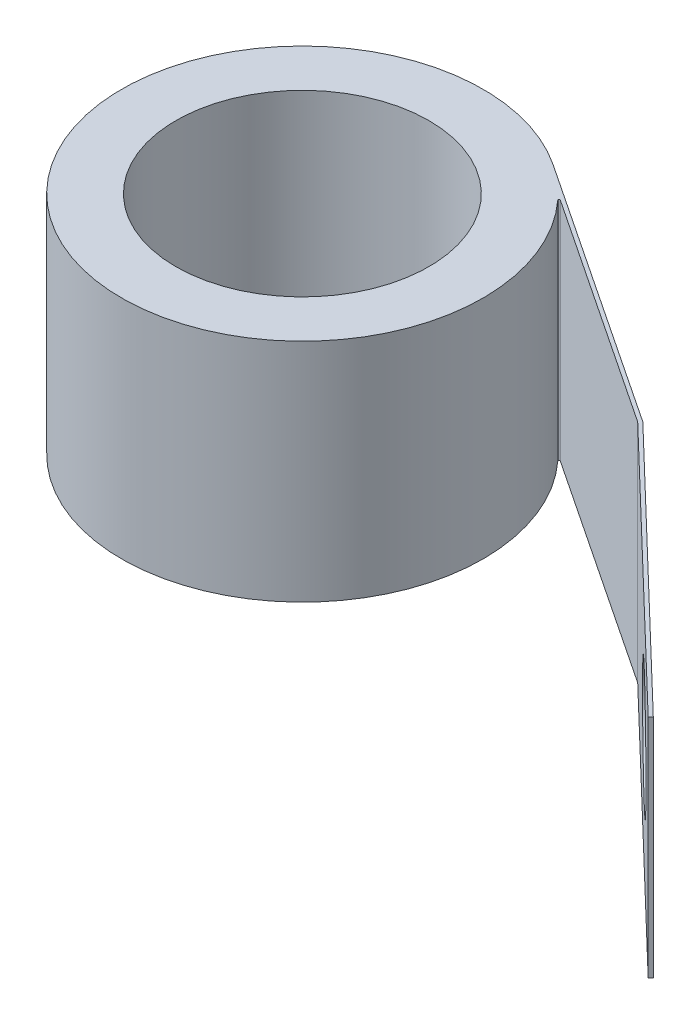
ISO-10303-21;
HEADER;
FILE_DESCRIPTION(('STEP AP214'),'2;1');
FILE_NAME('part.step','',(''),(''),'','','');
FILE_SCHEMA(('AUTOMOTIVE_DESIGN { 1 0 10303 214 1 1 1 1 }'));
ENDSEC;
DATA;
#1=APPLICATION_CONTEXT('core data for automotive mechanical design processes');
#2=APPLICATION_PROTOCOL_DEFINITION('international standard','automotive_design',2000,#1);
#3=PRODUCT_CONTEXT('',#1,'mechanical');
#4=PRODUCT('Part','Part','',(#3));
#5=PRODUCT_RELATED_PRODUCT_CATEGORY('part','',(#4));
#6=PRODUCT_DEFINITION_FORMATION('','',#4);
#7=PRODUCT_DEFINITION_CONTEXT('part definition',#1,'design');
#8=PRODUCT_DEFINITION('design','',#6,#7);
#9=PRODUCT_DEFINITION_SHAPE('','',#8);
#10=(LENGTH_UNIT() NAMED_UNIT(*) SI_UNIT(.MILLI.,.METRE.));
#11=(NAMED_UNIT(*) PLANE_ANGLE_UNIT() SI_UNIT($,.RADIAN.));
#12=(NAMED_UNIT(*) SI_UNIT($,.STERADIAN.) SOLID_ANGLE_UNIT());
#13=UNCERTAINTY_MEASURE_WITH_UNIT(LENGTH_MEASURE(1.E-05),#10,'distance_accuracy_value','');
#14=(GEOMETRIC_REPRESENTATION_CONTEXT(3) GLOBAL_UNCERTAINTY_ASSIGNED_CONTEXT((#13)) GLOBAL_UNIT_ASSIGNED_CONTEXT((#10,
#11,#12)) REPRESENTATION_CONTEXT('',''));
#15=CARTESIAN_POINT('',(0.,0.,0.));
#16=DIRECTION('',(0.,0.,1.));
#17=DIRECTION('',(1.,0.,0.));
#18=AXIS2_PLACEMENT_3D('',#15,#16,#17);
#19=CARTESIAN_POINT('',(0.,6.35,0.));
#20=DIRECTION('',(0.,-1.,0.));
#21=DIRECTION('',(0.,0.,-1.));
#22=AXIS2_PLACEMENT_3D('',#19,#20,#21);
#23=CYLINDRICAL_SURFACE('',#22,5.08);
#24=CARTESIAN_POINT('',(0.,0.,0.));
#25=DIRECTION('',(0.,1.,0.));
#26=DIRECTION('',(0.,0.,1.));
#27=AXIS2_PLACEMENT_3D('',#24,#25,#26);
#28=CIRCLE('',#27,5.08);
#29=CARTESIAN_POINT('',(2.81193797442188,0.,-4.23076882233055));
#30=VERTEX_POINT('',#29);
#31=CARTESIAN_POINT('',(3.74952969267497,0.,-3.42745198124624));
#32=VERTEX_POINT('',#31);
#33=EDGE_CURVE('E131',#30,#32,#28,.T.);
#34=ORIENTED_EDGE('',*,*,#33,.T.);
#35=DIRECTION('',(0.,-1.,0.));
#36=VECTOR('',#35,1.);
#37=CARTESIAN_POINT('',(3.74952969267497,6.35,-3.42745198124624));
#38=LINE('',#37,#36);
#39=CARTESIAN_POINT('',(3.74952969267497,6.35,-3.42745198124624));
#40=VERTEX_POINT('',#39);
#41=EDGE_CURVE('E50',#32,#40,#38,.F.);
#42=ORIENTED_EDGE('',*,*,#41,.T.);
#43=CARTESIAN_POINT('',(0.,6.35,0.));
#44=DIRECTION('',(0.,1.,0.));
#45=DIRECTION('',(0.,0.,1.));
#46=AXIS2_PLACEMENT_3D('',#43,#44,#45);
#47=CIRCLE('',#46,5.08);
#48=CARTESIAN_POINT('',(2.81193797442188,6.35,-4.23076882233055));
#49=VERTEX_POINT('',#48);
#50=EDGE_CURVE('E115',#49,#40,#47,.T.);
#51=ORIENTED_EDGE('',*,*,#50,.F.);
#52=DIRECTION('',(0.,-1.,0.));
#53=VECTOR('',#52,1.);
#54=CARTESIAN_POINT('',(2.81193797442188,6.35,-4.23076882233055));
#55=LINE('',#54,#53);
#56=EDGE_CURVE('E127',#49,#30,#55,.T.);
#57=ORIENTED_EDGE('',*,*,#56,.T.);
#58=EDGE_LOOP('',(#34,#42,#51,#57));
#59=FACE_BOUND('',#58,.T.);
#60=ADVANCED_FACE('F35',(#59),#23,.T.);
#61=CARTESIAN_POINT('',(2.75659084902538,6.35,-4.14749497537407));
#62=DIRECTION('',(-0.553531097327141,0.,0.832828508332784));
#63=DIRECTION('',(0.832828508332784,0.,0.553531097327141));
#64=AXIS2_PLACEMENT_3D('',#61,#62,#63);
#65=PLANE('',#64);
#66=DIRECTION('',(-0.832828508332784,0.,-0.553531097327141));
#67=VECTOR('',#66,1.);
#68=CARTESIAN_POINT('',(2.75659084902538,6.35,-4.14749497537407));
#69=LINE('',#68,#67);
#70=CARTESIAN_POINT('',(10.2646335648522,6.35,0.842650152571072));
#71=VERTEX_POINT('',#70);
#72=CARTESIAN_POINT('',(3.78233703101045,6.35,-3.46574308526412));
#73=VERTEX_POINT('',#72);
#74=EDGE_CURVE('E98',#71,#73,#69,.T.);
#75=ORIENTED_EDGE('',*,*,#74,.T.);
#76=DIRECTION('',(0.,-1.,0.));
#77=VECTOR('',#76,1.);
#78=CARTESIAN_POINT('',(3.78233703101045,6.35,-3.46574308526412));
#79=LINE('',#78,#77);
#80=CARTESIAN_POINT('',(3.78233703101045,0.,-3.46574308526412));
#81=VERTEX_POINT('',#80);
#82=EDGE_CURVE('E105',#73,#81,#79,.T.);
#83=ORIENTED_EDGE('',*,*,#82,.T.);
#84=DIRECTION('',(-0.832828508332784,0.,-0.553531097327141));
#85=VECTOR('',#84,1.);
#86=CARTESIAN_POINT('',(2.75659084902538,0.,-4.14749497537407));
#87=LINE('',#86,#85);
#88=CARTESIAN_POINT('',(10.2646335648522,0.,0.842650152571072));
#89=VERTEX_POINT('',#88);
#90=EDGE_CURVE('E100',#89,#81,#87,.T.);
#91=ORIENTED_EDGE('',*,*,#90,.F.);
#92=DIRECTION('',(0.,-1.,0.));
#93=VECTOR('',#92,1.);
#94=CARTESIAN_POINT('',(10.2646335648522,6.35,0.842650152571072));
#95=LINE('',#94,#93);
#96=EDGE_CURVE('E94',#71,#89,#95,.T.);
#97=ORIENTED_EDGE('',*,*,#96,.F.);
#98=EDGE_LOOP('',(#75,#83,#91,#97));
#99=FACE_BOUND('',#98,.T.);
#100=ADVANCED_FACE('F96',(#99),#65,.T.);
#101=CARTESIAN_POINT('',(4.5010411134167,6.35,-4.68941669030728));
#102=DIRECTION('',(-0.69246786360257,0.,0.721448721585736));
#103=DIRECTION('',(0.721448721585736,0.,0.69246786360257));
#104=AXIS2_PLACEMENT_3D('',#101,#102,#103);
#105=PLANE('',#104);
#106=CARTESIAN_POINT('',(14.8458329469216,3.175,5.2398210864474));
#107=DIRECTION('',(-0.69246786360257,0.,0.721448721585736));
#108=DIRECTION('',(0.721448721585736,0.,0.69246786360257));
#109=AXIS2_PLACEMENT_3D('',#106,#107,#108);
#110=CIRCLE('',#109,1.651);
#111=CARTESIAN_POINT('',(13.6547211075836,3.175,4.09655664363956));
#112=VERTEX_POINT('',#111);
#113=EDGE_CURVE('E132',#112,#112,#110,.T.);
#114=ORIENTED_EDGE('',*,*,#113,.F.);
#115=EDGE_LOOP('',(#114));
#116=FACE_BOUND('',#115,.T.);
#117=DIRECTION('',(-0.721448721585736,0.,-0.69246786360257));
#118=VECTOR('',#117,1.);
#119=CARTESIAN_POINT('',(4.5010411134167,0.,-4.68941669030728));
#120=LINE('',#119,#118);
#121=CARTESIAN_POINT('',(17.5945525761633,0.,7.87812364677318));
#122=VERTEX_POINT('',#121);
#123=EDGE_CURVE('E135',#122,#89,#120,.T.);
#124=ORIENTED_EDGE('',*,*,#123,.F.);
#125=DIRECTION('',(0.,-1.,0.));
#126=VECTOR('',#125,1.);
#127=CARTESIAN_POINT('',(17.5945525761633,6.35,7.87812364677318));
#128=LINE('',#127,#126);
#129=CARTESIAN_POINT('',(17.5945525761633,6.35,7.87812364677318));
#130=VERTEX_POINT('',#129);
#131=EDGE_CURVE('E106',#130,#122,#128,.T.);
#132=ORIENTED_EDGE('',*,*,#131,.F.);
#133=DIRECTION('',(-0.721448721585736,0.,-0.69246786360257));
#134=VECTOR('',#133,1.);
#135=CARTESIAN_POINT('',(4.5010411134167,6.35,-4.68941669030728));
#136=LINE('',#135,#134);
#137=EDGE_CURVE('E112',#130,#71,#136,.T.);
#138=ORIENTED_EDGE('',*,*,#137,.T.);
#139=ORIENTED_EDGE('',*,*,#96,.T.);
#140=EDGE_LOOP('',(#124,#132,#138,#139));
#141=FACE_BOUND('',#140,.T.);
#142=ADVANCED_FACE('F117',(#116,#141),#105,.T.);
#143=CARTESIAN_POINT('',(13.0935114627457,6.35,12.5675403370809));
#144=DIRECTION('',(0.721448721585702,0.,0.692467863602605));
#145=DIRECTION('',(0.692467863602605,0.,-0.721448721585702));
#146=AXIS2_PLACEMENT_3D('',#143,#144,#145);
#147=PLANE('',#146);
#148=DIRECTION('',(-0.692467863602605,0.,0.721448721585702));
#149=VECTOR('',#148,1.);
#150=CARTESIAN_POINT('',(13.0935114627457,0.,12.5675403370809));
#151=LINE('',#150,#149);
#152=CARTESIAN_POINT('',(17.6649073111053,0.,7.80482445666008));
#153=VERTEX_POINT('',#152);
#154=EDGE_CURVE('E137',#153,#122,#151,.T.);
#155=ORIENTED_EDGE('',*,*,#154,.F.);
#156=DIRECTION('',(0.,-1.,0.));
#157=VECTOR('',#156,1.);
#158=CARTESIAN_POINT('',(17.6649073111053,6.35,7.80482445666008));
#159=LINE('',#158,#157);
#160=CARTESIAN_POINT('',(17.6649073111053,6.35,7.80482445666008));
#161=VERTEX_POINT('',#160);
#162=EDGE_CURVE('E150',#161,#153,#159,.T.);
#163=ORIENTED_EDGE('',*,*,#162,.F.);
#164=DIRECTION('',(-0.692467863602605,0.,0.721448721585702));
#165=VECTOR('',#164,1.);
#166=CARTESIAN_POINT('',(13.0935114627457,6.35,12.5675403370809));
#167=LINE('',#166,#165);
#168=EDGE_CURVE('E118',#161,#130,#167,.T.);
#169=ORIENTED_EDGE('',*,*,#168,.T.);
#170=ORIENTED_EDGE('',*,*,#131,.T.);
#171=EDGE_LOOP('',(#155,#163,#169,#170));
#172=FACE_BOUND('',#171,.T.);
#173=ADVANCED_FACE('F160',(#172),#147,.T.);
#174=CARTESIAN_POINT('',(4.57139584835872,6.35,-4.76271588042039));
#175=DIRECTION('',(-0.69246786360257,0.,0.721448721585736));
#176=DIRECTION('',(0.721448721585736,0.,0.69246786360257));
#177=AXIS2_PLACEMENT_3D('',#174,#175,#176);
#178=PLANE('',#177);
#179=CARTESIAN_POINT('',(14.9161876818636,3.175,5.16652189633428));
#180=DIRECTION('',(0.69246786360257,0.,-0.721448721585736));
#181=DIRECTION('',(-0.721448721585736,0.,-0.69246786360257));
#182=AXIS2_PLACEMENT_3D('',#179,#180,#181);
#183=CIRCLE('',#182,1.651);
#184=CARTESIAN_POINT('',(13.7250758425256,3.175,4.02325745352644));
#185=VERTEX_POINT('',#184);
#186=EDGE_CURVE('E174',#185,#185,#183,.T.);
#187=ORIENTED_EDGE('',*,*,#186,.F.);
#188=EDGE_LOOP('',(#187));
#189=FACE_BOUND('',#188,.T.);
#190=DIRECTION('',(-0.721448721585736,0.,-0.69246786360257));
#191=VECTOR('',#190,1.);
#192=CARTESIAN_POINT('',(4.57139584835872,0.,-4.76271588042039));
#193=LINE('',#192,#191);
#194=CARTESIAN_POINT('',(10.3349882997942,0.,0.769350962457961));
#195=VERTEX_POINT('',#194);
#196=EDGE_CURVE('E140',#153,#195,#193,.T.);
#197=ORIENTED_EDGE('',*,*,#196,.T.);
#198=DIRECTION('',(0.,-1.,0.));
#199=VECTOR('',#198,1.);
#200=CARTESIAN_POINT('',(10.3349882997942,6.35,0.769350962457961));
#201=LINE('',#200,#199);
#202=CARTESIAN_POINT('',(10.3349882997942,6.35,0.769350962457961));
#203=VERTEX_POINT('',#202);
#204=EDGE_CURVE('E147',#203,#195,#201,.T.);
#205=ORIENTED_EDGE('',*,*,#204,.F.);
#206=DIRECTION('',(-0.721448721585736,0.,-0.69246786360257));
#207=VECTOR('',#206,1.);
#208=CARTESIAN_POINT('',(4.57139584835872,6.35,-4.76271588042039));
#209=LINE('',#208,#207);
#210=EDGE_CURVE('E120',#161,#203,#209,.T.);
#211=ORIENTED_EDGE('',*,*,#210,.F.);
#212=ORIENTED_EDGE('',*,*,#162,.T.);
#213=EDGE_LOOP('',(#197,#205,#211,#212));
#214=FACE_BOUND('',#213,.T.);
#215=ADVANCED_FACE('F166',(#189,#214),#178,.F.);
#216=CARTESIAN_POINT('',(0.,6.35,0.));
#217=DIRECTION('',(0.,-1.,0.));
#218=DIRECTION('',(0.,0.,-1.));
#219=AXIS2_PLACEMENT_3D('',#216,#217,#218);
#220=CYLINDRICAL_SURFACE('',#219,3.556);
#221=CARTESIAN_POINT('',(0.,6.35,0.));
#222=DIRECTION('',(0.,1.,0.));
#223=DIRECTION('',(0.,0.,1.));
#224=AXIS2_PLACEMENT_3D('',#221,#222,#223);
#225=CIRCLE('',#224,3.556);
#226=CARTESIAN_POINT('',(0.,6.35,3.556));
#227=VERTEX_POINT('',#226);
#228=EDGE_CURVE('E144',#227,#227,#225,.T.);
#229=ORIENTED_EDGE('',*,*,#228,.T.);
#230=EDGE_LOOP('',(#229));
#231=FACE_BOUND('',#230,.T.);
#232=CARTESIAN_POINT('',(0.,0.,0.));
#233=DIRECTION('',(0.,1.,0.));
#234=DIRECTION('',(0.,0.,1.));
#235=AXIS2_PLACEMENT_3D('',#232,#233,#234);
#236=CIRCLE('',#235,3.556);
#237=CARTESIAN_POINT('',(0.,0.,3.556));
#238=VERTEX_POINT('',#237);
#239=EDGE_CURVE('E128',#238,#238,#236,.T.);
#240=ORIENTED_EDGE('',*,*,#239,.F.);
#241=EDGE_LOOP('',(#240));
#242=FACE_BOUND('',#241,.T.);
#243=ADVANCED_FACE('F181',(#231,#242),#220,.F.);
#244=CARTESIAN_POINT('',(2.81193797442188,6.35,-4.23076882233055));
#245=DIRECTION('',(-0.553531097327141,0.,0.832828508332784));
#246=DIRECTION('',(0.832828508332784,0.,0.553531097327141));
#247=AXIS2_PLACEMENT_3D('',#244,#245,#246);
#248=PLANE('',#247);
#249=DIRECTION('',(-0.832828508332784,0.,-0.553531097327141));
#250=VECTOR('',#249,1.);
#251=CARTESIAN_POINT('',(2.81193797442188,0.,-4.23076882233055));
#252=LINE('',#251,#250);
#253=EDGE_CURVE('E142',#195,#30,#252,.T.);
#254=ORIENTED_EDGE('',*,*,#253,.T.);
#255=ORIENTED_EDGE('',*,*,#56,.F.);
#256=DIRECTION('',(-0.832828508332784,0.,-0.553531097327141));
#257=VECTOR('',#256,1.);
#258=CARTESIAN_POINT('',(2.81193797442188,6.35,-4.23076882233055));
#259=LINE('',#258,#257);
#260=EDGE_CURVE('E125',#203,#49,#259,.T.);
#261=ORIENTED_EDGE('',*,*,#260,.F.);
#262=ORIENTED_EDGE('',*,*,#204,.T.);
#263=EDGE_LOOP('',(#254,#255,#261,#262));
#264=FACE_BOUND('',#263,.T.);
#265=ADVANCED_FACE('F168',(#264),#248,.F.);
#266=CARTESIAN_POINT('',(0.,6.35,0.));
#267=DIRECTION('',(0.,1.,0.));
#268=DIRECTION('',(0.,0.,1.));
#269=AXIS2_PLACEMENT_3D('',#266,#267,#268);
#270=PLANE('',#269);
#271=ORIENTED_EDGE('',*,*,#228,.F.);
#272=EDGE_LOOP('',(#271));
#273=FACE_BOUND('',#272,.T.);
#274=ORIENTED_EDGE('',*,*,#50,.T.);
#275=CARTESIAN_POINT('',(3.76827734113834,6.35,-3.44458924115247));
#276=DIRECTION('',(0.,1.,0.));
#277=DIRECTION('',(0.,0.,1.));
#278=AXIS2_PLACEMENT_3D('',#275,#276,#277);
#279=CIRCLE('',#278,0.0254);
#280=EDGE_CURVE('E11',#40,#73,#279,.F.);
#281=ORIENTED_EDGE('',*,*,#280,.T.);
#282=ORIENTED_EDGE('',*,*,#74,.F.);
#283=ORIENTED_EDGE('',*,*,#137,.F.);
#284=ORIENTED_EDGE('',*,*,#168,.F.);
#285=ORIENTED_EDGE('',*,*,#210,.T.);
#286=ORIENTED_EDGE('',*,*,#260,.T.);
#287=EDGE_LOOP('',(#274,#281,#282,#283,#284,#285,#286));
#288=FACE_BOUND('',#287,.T.);
#289=ADVANCED_FACE('F110',(#273,#288),#270,.T.);
#290=CARTESIAN_POINT('',(0.,0.,0.));
#291=DIRECTION('',(0.,1.,0.));
#292=DIRECTION('',(0.,0.,1.));
#293=AXIS2_PLACEMENT_3D('',#290,#291,#292);
#294=PLANE('',#293);
#295=ORIENTED_EDGE('',*,*,#239,.T.);
#296=EDGE_LOOP('',(#295));
#297=FACE_BOUND('',#296,.T.);
#298=ORIENTED_EDGE('',*,*,#33,.F.);
#299=ORIENTED_EDGE('',*,*,#253,.F.);
#300=ORIENTED_EDGE('',*,*,#196,.F.);
#301=ORIENTED_EDGE('',*,*,#154,.T.);
#302=ORIENTED_EDGE('',*,*,#123,.T.);
#303=ORIENTED_EDGE('',*,*,#90,.T.);
#304=CARTESIAN_POINT('',(3.76827734113834,0.,-3.44458924115247));
#305=DIRECTION('',(0.,1.,0.));
#306=DIRECTION('',(0.,0.,1.));
#307=AXIS2_PLACEMENT_3D('',#304,#305,#306);
#308=CIRCLE('',#307,0.0254);
#309=EDGE_CURVE('E43',#81,#32,#308,.T.);
#310=ORIENTED_EDGE('',*,*,#309,.T.);
#311=EDGE_LOOP('',(#298,#299,#300,#301,#302,#303,#310));
#312=FACE_BOUND('',#311,.T.);
#313=ADVANCED_FACE('F155',(#297,#312),#294,.F.);
#314=CARTESIAN_POINT('',(10.5190167479873,3.175,9.74772127840371));
#315=DIRECTION('',(0.69246786360257,0.,-0.721448721585736));
#316=DIRECTION('',(-0.721448721585736,0.,-0.69246786360257));
#317=AXIS2_PLACEMENT_3D('',#314,#315,#316);
#318=CYLINDRICAL_SURFACE('',#317,1.651);
#319=CARTESIAN_POINT('',(13.6547211075836,3.175,4.09655664363956));
#320=CARTESIAN_POINT('',(13.6554539694059,3.175,4.09579311040921));
#321=CARTESIAN_POINT('',(13.6561868312282,3.175,4.09502957717887));
#322=CARTESIAN_POINT('',(13.6576525548728,3.175,4.09350251071818));
#323=CARTESIAN_POINT('',(13.6583854166951,3.175,4.09273897748783));
#324=CARTESIAN_POINT('',(13.6598511403398,3.175,4.09121191102714));
#325=CARTESIAN_POINT('',(13.6605840021621,3.175,4.0904483777968));
#326=CARTESIAN_POINT('',(13.6620497258067,3.175,4.08892131133611));
#327=CARTESIAN_POINT('',(13.662782587629,3.175,4.08815777810576));
#328=CARTESIAN_POINT('',(13.6642483112736,3.175,4.08663071164507));
#329=CARTESIAN_POINT('',(13.6649811730959,3.175,4.08586717841473));
#330=CARTESIAN_POINT('',(13.6664468967406,3.175,4.08434011195404));
#331=CARTESIAN_POINT('',(13.6671797585629,3.175,4.08357657872369));
#332=CARTESIAN_POINT('',(13.6686454822075,3.175,4.082049512263));
#333=CARTESIAN_POINT('',(13.6693783440298,3.175,4.08128597903266));
#334=CARTESIAN_POINT('',(13.6708440676745,3.175,4.07975891257197));
#335=CARTESIAN_POINT('',(13.6715769294968,3.175,4.07899537934162));
#336=CARTESIAN_POINT('',(13.6730426531414,3.175,4.07746831288093));
#337=CARTESIAN_POINT('',(13.6737755149637,3.175,4.07670477965059));
#338=CARTESIAN_POINT('',(13.6752412386083,3.175,4.0751777131899));
#339=CARTESIAN_POINT('',(13.6759741004306,3.175,4.07441417995955));
#340=CARTESIAN_POINT('',(13.6774398240753,3.175,4.07288711349886));
#341=CARTESIAN_POINT('',(13.6781726858976,3.175,4.07212358026852));
#342=CARTESIAN_POINT('',(13.6796384095422,3.175,4.07059651380783));
#343=CARTESIAN_POINT('',(13.6803712713645,3.175,4.06983298057748));
#344=CARTESIAN_POINT('',(13.6818369950091,3.175,4.06830591411679));
#345=CARTESIAN_POINT('',(13.6825698568315,3.175,4.06754238088645));
#346=CARTESIAN_POINT('',(13.6840355804761,3.175,4.06601531442576));
#347=CARTESIAN_POINT('',(13.6847684422984,3.175,4.06525178119541));
#348=CARTESIAN_POINT('',(13.686234165943,3.175,4.06372471473473));
#349=CARTESIAN_POINT('',(13.6869670277653,3.175,4.06296118150438));
#350=CARTESIAN_POINT('',(13.68843275141,3.175,4.06143411504369));
#351=CARTESIAN_POINT('',(13.6891656132323,3.175,4.06067058181335));
#352=CARTESIAN_POINT('',(13.6906313368769,3.175,4.05914351535265));
#353=CARTESIAN_POINT('',(13.6913641986992,3.175,4.05837998212231));
#354=CARTESIAN_POINT('',(13.6928299223438,3.175,4.05685291566162));
#355=CARTESIAN_POINT('',(13.6935627841661,3.175,4.05608938243128));
#356=CARTESIAN_POINT('',(13.6950285078108,3.175,4.05456231597059));
#357=CARTESIAN_POINT('',(13.6957613696331,3.175,4.05379878274024));
#358=CARTESIAN_POINT('',(13.6972270932777,3.175,4.05227171627955));
#359=CARTESIAN_POINT('',(13.6979599551,3.175,4.05150818304921));
#360=CARTESIAN_POINT('',(13.6994256787446,3.175,4.04998111658852));
#361=CARTESIAN_POINT('',(13.700158540567,3.175,4.04921758335817));
#362=CARTESIAN_POINT('',(13.7016242642116,3.175,4.04769051689748));
#363=CARTESIAN_POINT('',(13.7023571260339,3.175,4.04692698366714));
#364=CARTESIAN_POINT('',(13.7038228496785,3.175,4.04539991720645));
#365=CARTESIAN_POINT('',(13.7045557115008,3.175,4.0446363839761));
#366=CARTESIAN_POINT('',(13.7060214351455,3.175,4.04310931751541));
#367=CARTESIAN_POINT('',(13.7067542969678,3.175,4.04234578428507));
#368=CARTESIAN_POINT('',(13.7082200206124,3.175,4.04081871782438));
#369=CARTESIAN_POINT('',(13.7089528824347,3.175,4.04005518459403));
#370=CARTESIAN_POINT('',(13.7104186060793,3.175,4.03852811813334));
#371=CARTESIAN_POINT('',(13.7111514679017,3.175,4.037764584903));
#372=CARTESIAN_POINT('',(13.7126171915463,3.175,4.03623751844231));
#373=CARTESIAN_POINT('',(13.7133500533686,3.175,4.03547398521196));
#374=CARTESIAN_POINT('',(13.7148157770132,3.175,4.03394691875127));
#375=CARTESIAN_POINT('',(13.7155486388355,3.175,4.03318338552093));
#376=CARTESIAN_POINT('',(13.7170143624802,3.175,4.03165631906024));
#377=CARTESIAN_POINT('',(13.7177472243025,3.175,4.03089278582989));
#378=CARTESIAN_POINT('',(13.7192129479471,3.175,4.0293657193692));
#379=CARTESIAN_POINT('',(13.7199458097694,3.175,4.02860218613886));
#380=CARTESIAN_POINT('',(13.721411533414,3.175,4.02707511967817));
#381=CARTESIAN_POINT('',(13.7221443952363,3.175,4.02631158644782));
#382=CARTESIAN_POINT('',(13.723610118881,3.175,4.02478451998713));
#383=CARTESIAN_POINT('',(13.7243429807033,3.175,4.02402098675679));
#384=CARTESIAN_POINT('',(13.7250758425256,3.175,4.02325745352644));
#385=B_SPLINE_CURVE_WITH_KNOTS('',3,(#319,#320,#321,#322,#323,#324,#325,#326,#327,#328,#329,
#330,#331,#332,#333,#334,#335,#336,#337,#338,#339,#340,#341,#342,#343,#344,#345,#346,#347,#348,
#349,#350,#351,#352,#353,#354,#355,#356,#357,#358,#359,#360,#361,#362,#363,#364,#365,#366,#367,
#368,#369,#370,#371,#372,#373,#374,#375,#376,#377,#378,#379,#380,#381,#382,#383,#384),
.UNSPECIFIED.,.F.,.F.,(4,2,2,2,2,2,2,2,2,2,2,2,2,2,2,2,2,2,2,2,2,2,2,2,2,2,2,2,2,2,2,2,4),(0.,
0.00317499999999952,0.00634999999999904,0.00952499999999914,0.0126999999999999,
0.0158749999999994,0.0190499999999983,0.022224999999999,0.0253999999999997,0.0285749999999992,
0.03175,0.0349250000000001,0.0380999999999996,0.0412749999999991,0.0444499999999992,
0.0476249999999999,0.0507999999999994,0.053974999999999,0.0571500000000009,0.0603249999999998,
0.0634999999999993,0.0666750000000001,0.0698499999999989,0.0730249999999997,0.0761999999999992,
0.0793749999999999,0.0825500000000007,0.0857249999999996,0.0888999999999991,0.092075000000001,
0.0952499999999999,0.0984249999999994,0.1016),.UNSPECIFIED.);
#386=EDGE_CURVE('BSEAM178',#112,#185,#385,.T.);
#387=ORIENTED_EDGE('',*,*,#113,.T.);
#388=ORIENTED_EDGE('',*,*,#186,.T.);
#389=ORIENTED_EDGE('',*,*,#386,.T.);
#390=ORIENTED_EDGE('',*,*,#386,.F.);
#391=EDGE_LOOP('',(#387,#389,#388,#390));
#392=FACE_BOUND('',#391,.T.);
#393=ADVANCED_FACE('F178',(#392),#318,.F.);
#394=CARTESIAN_POINT('',(3.76827734113834,6.35,-3.44458924115247));
#395=DIRECTION('',(0.,-1.,0.));
#396=DIRECTION('',(0.,0.,-1.));
#397=AXIS2_PLACEMENT_3D('',#394,#395,#396);
#398=CYLINDRICAL_SURFACE('',#397,0.0254);
#399=ORIENTED_EDGE('',*,*,#280,.F.);
#400=ORIENTED_EDGE('',*,*,#41,.F.);
#401=ORIENTED_EDGE('',*,*,#309,.F.);
#402=ORIENTED_EDGE('',*,*,#82,.F.);
#403=EDGE_LOOP('',(#399,#400,#401,#402));
#404=FACE_BOUND('',#403,.T.);
#405=ADVANCED_FACE('F37',(#404),#398,.F.);
#406=CLOSED_SHELL('',(#60,#100,#142,#173,#215,#243,#265,#289,#313,#393,#405));
#407=MANIFOLD_SOLID_BREP('B2',#406);
#408=ADVANCED_BREP_SHAPE_REPRESENTATION('',(#18,#407),#14);
#409=SHAPE_DEFINITION_REPRESENTATION(#9,#408);
ENDSEC;
END-ISO-10303-21;
